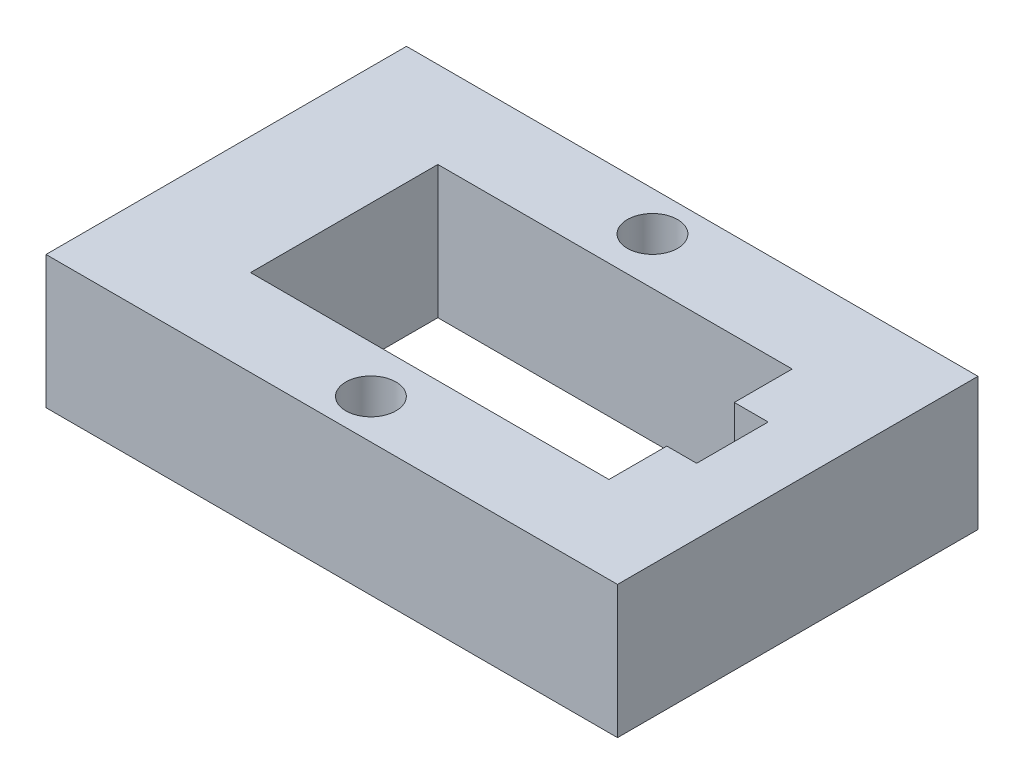
ISO-10303-21;
HEADER;
FILE_DESCRIPTION(('STEP AP214'),'2;1');
FILE_NAME('part.step','',(''),(''),'','','');
FILE_SCHEMA(('AUTOMOTIVE_DESIGN { 1 0 10303 214 1 1 1 1 }'));
ENDSEC;
DATA;
#1=APPLICATION_CONTEXT('core data for automotive mechanical design processes');
#2=APPLICATION_PROTOCOL_DEFINITION('international standard','automotive_design',2000,#1);
#3=PRODUCT_CONTEXT('',#1,'mechanical');
#4=PRODUCT('Part','Part','',(#3));
#5=PRODUCT_RELATED_PRODUCT_CATEGORY('part','',(#4));
#6=PRODUCT_DEFINITION_FORMATION('','',#4);
#7=PRODUCT_DEFINITION_CONTEXT('part definition',#1,'design');
#8=PRODUCT_DEFINITION('design','',#6,#7);
#9=PRODUCT_DEFINITION_SHAPE('','',#8);
#10=(LENGTH_UNIT() NAMED_UNIT(*) SI_UNIT(.MILLI.,.METRE.));
#11=(NAMED_UNIT(*) PLANE_ANGLE_UNIT() SI_UNIT($,.RADIAN.));
#12=(NAMED_UNIT(*) SI_UNIT($,.STERADIAN.) SOLID_ANGLE_UNIT());
#13=UNCERTAINTY_MEASURE_WITH_UNIT(LENGTH_MEASURE(1.E-05),#10,'distance_accuracy_value','');
#14=(GEOMETRIC_REPRESENTATION_CONTEXT(3) GLOBAL_UNCERTAINTY_ASSIGNED_CONTEXT((#13)) GLOBAL_UNIT_ASSIGNED_CONTEXT((#10,
#11,#12)) REPRESENTATION_CONTEXT('',''));
#15=CARTESIAN_POINT('',(0.,0.,0.));
#16=DIRECTION('',(0.,0.,1.));
#17=DIRECTION('',(1.,0.,0.));
#18=AXIS2_PLACEMENT_3D('',#15,#16,#17);
#19=CARTESIAN_POINT('',(0.,4.5,0.));
#20=DIRECTION('',(0.,1.,0.));
#21=DIRECTION('',(0.,0.,1.));
#22=AXIS2_PLACEMENT_3D('',#19,#20,#21);
#23=PLANE('',#22);
#24=CARTESIAN_POINT('',(-1.2726821184778,4.5,-10.9543613464888));
#25=DIRECTION('',(0.,1.,0.));
#26=DIRECTION('',(0.,0.,1.));
#27=AXIS2_PLACEMENT_3D('',#24,#25,#26);
#28=CIRCLE('',#27,1.7);
#29=CARTESIAN_POINT('',(-1.2726821184778,4.5,-9.25436134648878));
#30=VERTEX_POINT('',#29);
#31=EDGE_CURVE('E177',#30,#30,#28,.T.);
#32=ORIENTED_EDGE('',*,*,#31,.F.);
#33=EDGE_LOOP('',(#32));
#34=FACE_BOUND('',#33,.T.);
#35=DIRECTION('',(0.,0.,1.));
#36=VECTOR('',#35,1.);
#37=CARTESIAN_POINT('',(-20.6290016384778,4.5,-13.6320813464888));
#38=LINE('',#37,#36);
#39=CARTESIAN_POINT('',(-20.6290016384778,4.5,-13.6320813464888));
#40=VERTEX_POINT('',#39);
#41=CARTESIAN_POINT('',(-20.6290016384778,4.5,10.8109486535112));
#42=VERTEX_POINT('',#41);
#43=EDGE_CURVE('E221',#40,#42,#38,.T.);
#44=ORIENTED_EDGE('',*,*,#43,.T.);
#45=DIRECTION('',(1.,0.,0.));
#46=VECTOR('',#45,1.);
#47=CARTESIAN_POINT('',(-20.6290016384778,4.5,10.8109486535112));
#48=LINE('',#47,#46);
#49=CARTESIAN_POINT('',(18.1229383615222,4.5,10.8109486535112));
#50=VERTEX_POINT('',#49);
#51=EDGE_CURVE('E225',#42,#50,#48,.T.);
#52=ORIENTED_EDGE('',*,*,#51,.T.);
#53=DIRECTION('',(0.,0.,-1.));
#54=VECTOR('',#53,1.);
#55=CARTESIAN_POINT('',(18.1229383615222,4.5,-13.6320813464888));
#56=LINE('',#55,#54);
#57=CARTESIAN_POINT('',(18.1229383615222,4.5,-13.6320813464888));
#58=VERTEX_POINT('',#57);
#59=EDGE_CURVE('E229',#50,#58,#56,.T.);
#60=ORIENTED_EDGE('',*,*,#59,.T.);
#61=DIRECTION('',(-1.,0.,0.));
#62=VECTOR('',#61,1.);
#63=CARTESIAN_POINT('',(-20.6290016384778,4.5,-13.6320813464888));
#64=LINE('',#63,#62);
#65=EDGE_CURVE('E232',#58,#40,#64,.T.);
#66=ORIENTED_EDGE('',*,*,#65,.T.);
#67=EDGE_LOOP('',(#44,#52,#60,#66));
#68=FACE_BOUND('',#67,.T.);
#69=DIRECTION('',(1.,0.,0.));
#70=VECTOR('',#69,1.);
#71=CARTESIAN_POINT('',(11.6709983615222,4.5,4.94094865351122));
#72=LINE('',#71,#70);
#73=CARTESIAN_POINT('',(-12.6290016384778,4.5,4.94094865351122));
#74=VERTEX_POINT('',#73);
#75=CARTESIAN_POINT('',(11.6709983615222,4.5,4.94094865351122));
#76=VERTEX_POINT('',#75);
#77=EDGE_CURVE('E138',#74,#76,#72,.T.);
#78=ORIENTED_EDGE('',*,*,#77,.F.);
#79=DIRECTION('',(0.,0.,1.));
#80=VECTOR('',#79,1.);
#81=CARTESIAN_POINT('',(-12.6290016384778,4.5,4.94094865351122));
#82=LINE('',#81,#80);
#83=CARTESIAN_POINT('',(-12.6290016384778,4.5,-7.75905134648878));
#84=VERTEX_POINT('',#83);
#85=EDGE_CURVE('E129',#84,#74,#82,.T.);
#86=ORIENTED_EDGE('',*,*,#85,.F.);
#87=DIRECTION('',(-1.,0.,0.));
#88=VECTOR('',#87,1.);
#89=CARTESIAN_POINT('',(-12.6290016384778,4.5,-7.75905134648878));
#90=LINE('',#89,#88);
#91=CARTESIAN_POINT('',(11.3955588266385,4.5,-7.75905134648878));
#92=VERTEX_POINT('',#91);
#93=EDGE_CURVE('E172',#92,#84,#90,.T.);
#94=ORIENTED_EDGE('',*,*,#93,.F.);
#95=DIRECTION('',(0.,0.,-1.));
#96=VECTOR('',#95,1.);
#97=CARTESIAN_POINT('',(11.3955588266385,4.5,-7.75905134648878));
#98=LINE('',#97,#96);
#99=CARTESIAN_POINT('',(11.3955588266385,4.5,-3.83394634648878));
#100=VERTEX_POINT('',#99);
#101=EDGE_CURVE('E169',#100,#92,#98,.T.);
#102=ORIENTED_EDGE('',*,*,#101,.F.);
#103=DIRECTION('',(-1.,0.,0.));
#104=VECTOR('',#103,1.);
#105=CARTESIAN_POINT('',(11.3955588266385,4.5,-3.83394634648878));
#106=LINE('',#105,#104);
#107=CARTESIAN_POINT('',(13.6929483615222,4.5,-3.83394634648878));
#108=VERTEX_POINT('',#107);
#109=EDGE_CURVE('E166',#108,#100,#106,.T.);
#110=ORIENTED_EDGE('',*,*,#109,.F.);
#111=DIRECTION('',(0.,0.,-1.));
#112=VECTOR('',#111,1.);
#113=CARTESIAN_POINT('',(13.6929483615222,4.5,-3.83394634648878));
#114=LINE('',#113,#112);
#115=CARTESIAN_POINT('',(13.6929483615222,4.5,1.01584365351122));
#116=VERTEX_POINT('',#115);
#117=EDGE_CURVE('E163',#116,#108,#114,.T.);
#118=ORIENTED_EDGE('',*,*,#117,.F.);
#119=DIRECTION('',(1.,0.,0.));
#120=VECTOR('',#119,1.);
#121=CARTESIAN_POINT('',(13.6929483615222,4.5,1.01584365351122));
#122=LINE('',#121,#120);
#123=CARTESIAN_POINT('',(11.6709983615222,4.5,1.01584365351122));
#124=VERTEX_POINT('',#123);
#125=EDGE_CURVE('E157',#124,#116,#122,.T.);
#126=ORIENTED_EDGE('',*,*,#125,.F.);
#127=DIRECTION('',(0.,0.,-1.));
#128=VECTOR('',#127,1.);
#129=CARTESIAN_POINT('',(11.6709983615222,4.5,1.01584365351122));
#130=LINE('',#129,#128);
#131=EDGE_CURVE('E153',#76,#124,#130,.T.);
#132=ORIENTED_EDGE('',*,*,#131,.F.);
#133=EDGE_LOOP('',(#78,#86,#94,#102,#110,#118,#126,#132));
#134=FACE_BOUND('',#133,.T.);
#135=CARTESIAN_POINT('',(-1.27706163847779,4.5,8.13094865351122));
#136=DIRECTION('',(0.,1.,0.));
#137=DIRECTION('',(0.,0.,1.));
#138=AXIS2_PLACEMENT_3D('',#135,#136,#137);
#139=CIRCLE('',#138,1.7);
#140=CARTESIAN_POINT('',(-1.27706163847779,4.5,9.83094865351122));
#141=VERTEX_POINT('',#140);
#142=EDGE_CURVE('E338',#141,#141,#139,.T.);
#143=ORIENTED_EDGE('',*,*,#142,.F.);
#144=EDGE_LOOP('',(#143));
#145=FACE_BOUND('',#144,.T.);
#146=ADVANCED_FACE('F39',(#34,#68,#134,#145),#23,.T.);
#147=CARTESIAN_POINT('',(0.,-4.5,0.));
#148=DIRECTION('',(0.,1.,0.));
#149=DIRECTION('',(0.,0.,1.));
#150=AXIS2_PLACEMENT_3D('',#147,#148,#149);
#151=PLANE('',#150);
#152=DIRECTION('',(0.,0.,1.));
#153=VECTOR('',#152,1.);
#154=CARTESIAN_POINT('',(-20.6290016384778,-4.5,-13.6320813464888));
#155=LINE('',#154,#153);
#156=CARTESIAN_POINT('',(-20.6290016384778,-4.5,-13.6320813464888));
#157=VERTEX_POINT('',#156);
#158=CARTESIAN_POINT('',(-20.6290016384778,-4.5,10.8109486535112));
#159=VERTEX_POINT('',#158);
#160=EDGE_CURVE('E147',#157,#159,#155,.T.);
#161=ORIENTED_EDGE('',*,*,#160,.F.);
#162=DIRECTION('',(-1.,0.,0.));
#163=VECTOR('',#162,1.);
#164=CARTESIAN_POINT('',(-20.6290016384778,-4.5,-13.6320813464888));
#165=LINE('',#164,#163);
#166=CARTESIAN_POINT('',(18.1229383615222,-4.5,-13.6320813464888));
#167=VERTEX_POINT('',#166);
#168=EDGE_CURVE('E226',#167,#157,#165,.T.);
#169=ORIENTED_EDGE('',*,*,#168,.F.);
#170=DIRECTION('',(0.,0.,-1.));
#171=VECTOR('',#170,1.);
#172=CARTESIAN_POINT('',(18.1229383615222,-4.5,-13.6320813464888));
#173=LINE('',#172,#171);
#174=CARTESIAN_POINT('',(18.1229383615222,-4.5,10.8109486535112));
#175=VERTEX_POINT('',#174);
#176=EDGE_CURVE('E242',#175,#167,#173,.T.);
#177=ORIENTED_EDGE('',*,*,#176,.F.);
#178=DIRECTION('',(1.,0.,0.));
#179=VECTOR('',#178,1.);
#180=CARTESIAN_POINT('',(-20.6290016384778,-4.5,10.8109486535112));
#181=LINE('',#180,#179);
#182=EDGE_CURVE('E239',#159,#175,#181,.T.);
#183=ORIENTED_EDGE('',*,*,#182,.F.);
#184=EDGE_LOOP('',(#161,#169,#177,#183));
#185=FACE_BOUND('',#184,.T.);
#186=DIRECTION('',(0.,0.,1.));
#187=VECTOR('',#186,1.);
#188=CARTESIAN_POINT('',(-12.6290016384778,-4.5,4.94094865351122));
#189=LINE('',#188,#187);
#190=CARTESIAN_POINT('',(-12.6290016384778,-4.5,-7.75905134648878));
#191=VERTEX_POINT('',#190);
#192=CARTESIAN_POINT('',(-12.6290016384778,-4.5,4.94094865351122));
#193=VERTEX_POINT('',#192);
#194=EDGE_CURVE('E63',#191,#193,#189,.T.);
#195=ORIENTED_EDGE('',*,*,#194,.T.);
#196=DIRECTION('',(1.,0.,0.));
#197=VECTOR('',#196,1.);
#198=CARTESIAN_POINT('',(11.6709983615222,-4.5,4.94094865351122));
#199=LINE('',#198,#197);
#200=CARTESIAN_POINT('',(11.6709983615222,-4.5,4.94094865351122));
#201=VERTEX_POINT('',#200);
#202=EDGE_CURVE('E145',#193,#201,#199,.T.);
#203=ORIENTED_EDGE('',*,*,#202,.T.);
#204=DIRECTION('',(0.,0.,-1.));
#205=VECTOR('',#204,1.);
#206=CARTESIAN_POINT('',(11.6709983615222,-4.5,1.01584365351122));
#207=LINE('',#206,#205);
#208=CARTESIAN_POINT('',(11.6709983615222,-4.5,1.01584365351122));
#209=VERTEX_POINT('',#208);
#210=EDGE_CURVE('E180',#201,#209,#207,.T.);
#211=ORIENTED_EDGE('',*,*,#210,.T.);
#212=DIRECTION('',(1.,0.,0.));
#213=VECTOR('',#212,1.);
#214=CARTESIAN_POINT('',(13.6929483615222,-4.5,1.01584365351122));
#215=LINE('',#214,#213);
#216=CARTESIAN_POINT('',(13.6929483615222,-4.5,1.01584365351122));
#217=VERTEX_POINT('',#216);
#218=EDGE_CURVE('E184',#209,#217,#215,.T.);
#219=ORIENTED_EDGE('',*,*,#218,.T.);
#220=DIRECTION('',(0.,0.,-1.));
#221=VECTOR('',#220,1.);
#222=CARTESIAN_POINT('',(13.6929483615222,-4.5,-3.83394634648878));
#223=LINE('',#222,#221);
#224=CARTESIAN_POINT('',(13.6929483615222,-4.5,-3.83394634648878));
#225=VERTEX_POINT('',#224);
#226=EDGE_CURVE('E188',#217,#225,#223,.T.);
#227=ORIENTED_EDGE('',*,*,#226,.T.);
#228=DIRECTION('',(-1.,0.,0.));
#229=VECTOR('',#228,1.);
#230=CARTESIAN_POINT('',(11.3955588266385,-4.5,-3.83394634648878));
#231=LINE('',#230,#229);
#232=CARTESIAN_POINT('',(11.3955588266385,-4.5,-3.83394634648878));
#233=VERTEX_POINT('',#232);
#234=EDGE_CURVE('E192',#225,#233,#231,.T.);
#235=ORIENTED_EDGE('',*,*,#234,.T.);
#236=DIRECTION('',(0.,0.,-1.));
#237=VECTOR('',#236,1.);
#238=CARTESIAN_POINT('',(11.3955588266385,-4.5,-7.75905134648878));
#239=LINE('',#238,#237);
#240=CARTESIAN_POINT('',(11.3955588266385,-4.5,-7.75905134648878));
#241=VERTEX_POINT('',#240);
#242=EDGE_CURVE('E196',#233,#241,#239,.T.);
#243=ORIENTED_EDGE('',*,*,#242,.T.);
#244=DIRECTION('',(-1.,0.,0.));
#245=VECTOR('',#244,1.);
#246=CARTESIAN_POINT('',(-12.6290016384778,-4.5,-7.75905134648878));
#247=LINE('',#246,#245);
#248=EDGE_CURVE('E139',#241,#191,#247,.T.);
#249=ORIENTED_EDGE('',*,*,#248,.T.);
#250=EDGE_LOOP('',(#195,#203,#211,#219,#227,#235,#243,#249));
#251=FACE_BOUND('',#250,.T.);
#252=CARTESIAN_POINT('',(-1.2726821184778,-4.5,-10.9543613464888));
#253=DIRECTION('',(0.,1.,0.));
#254=DIRECTION('',(0.,0.,1.));
#255=AXIS2_PLACEMENT_3D('',#252,#253,#254);
#256=CIRCLE('',#255,1.7);
#257=CARTESIAN_POINT('',(-1.2726821184778,-4.5,-9.25436134648878));
#258=VERTEX_POINT('',#257);
#259=EDGE_CURVE('E346',#258,#258,#256,.T.);
#260=ORIENTED_EDGE('',*,*,#259,.T.);
#261=EDGE_LOOP('',(#260));
#262=FACE_BOUND('',#261,.T.);
#263=CARTESIAN_POINT('',(-1.27706163847779,-4.5,8.13094865351122));
#264=DIRECTION('',(0.,1.,0.));
#265=DIRECTION('',(0.,0.,1.));
#266=AXIS2_PLACEMENT_3D('',#263,#264,#265);
#267=CIRCLE('',#266,1.7);
#268=CARTESIAN_POINT('',(-1.27706163847779,-4.5,9.83094865351122));
#269=VERTEX_POINT('',#268);
#270=EDGE_CURVE('E341',#269,#269,#267,.T.);
#271=ORIENTED_EDGE('',*,*,#270,.T.);
#272=EDGE_LOOP('',(#271));
#273=FACE_BOUND('',#272,.T.);
#274=ADVANCED_FACE('F265',(#185,#251,#262,#273),#151,.F.);
#275=CARTESIAN_POINT('',(-20.6290016384778,4.5,-13.6320813464888));
#276=DIRECTION('',(1.,0.,0.));
#277=DIRECTION('',(0.,0.,-1.));
#278=AXIS2_PLACEMENT_3D('',#275,#276,#277);
#279=PLANE('',#278);
#280=ORIENTED_EDGE('',*,*,#160,.T.);
#281=DIRECTION('',(0.,-1.,0.));
#282=VECTOR('',#281,1.);
#283=CARTESIAN_POINT('',(-20.6290016384778,4.5,10.8109486535112));
#284=LINE('',#283,#282);
#285=EDGE_CURVE('E11',#42,#159,#284,.T.);
#286=ORIENTED_EDGE('',*,*,#285,.F.);
#287=ORIENTED_EDGE('',*,*,#43,.F.);
#288=DIRECTION('',(0.,-1.,0.));
#289=VECTOR('',#288,1.);
#290=CARTESIAN_POINT('',(-20.6290016384778,4.5,-13.6320813464888));
#291=LINE('',#290,#289);
#292=EDGE_CURVE('E235',#40,#157,#291,.T.);
#293=ORIENTED_EDGE('',*,*,#292,.T.);
#294=EDGE_LOOP('',(#280,#286,#287,#293));
#295=FACE_BOUND('',#294,.T.);
#296=ADVANCED_FACE('F41',(#295),#279,.F.);
#297=CARTESIAN_POINT('',(-20.6290016384778,4.5,10.8109486535112));
#298=DIRECTION('',(0.,0.,-1.));
#299=DIRECTION('',(-1.,0.,0.));
#300=AXIS2_PLACEMENT_3D('',#297,#298,#299);
#301=PLANE('',#300);
#302=ORIENTED_EDGE('',*,*,#182,.T.);
#303=DIRECTION('',(0.,-1.,0.));
#304=VECTOR('',#303,1.);
#305=CARTESIAN_POINT('',(18.1229383615222,4.5,10.8109486535112));
#306=LINE('',#305,#304);
#307=EDGE_CURVE('E48',#50,#175,#306,.T.);
#308=ORIENTED_EDGE('',*,*,#307,.F.);
#309=ORIENTED_EDGE('',*,*,#51,.F.);
#310=ORIENTED_EDGE('',*,*,#285,.T.);
#311=EDGE_LOOP('',(#302,#308,#309,#310));
#312=FACE_BOUND('',#311,.T.);
#313=ADVANCED_FACE('F275',(#312),#301,.F.);
#314=CARTESIAN_POINT('',(18.1229383615222,4.5,-13.6320813464888));
#315=DIRECTION('',(-1.,0.,0.));
#316=DIRECTION('',(0.,0.,1.));
#317=AXIS2_PLACEMENT_3D('',#314,#315,#316);
#318=PLANE('',#317);
#319=ORIENTED_EDGE('',*,*,#176,.T.);
#320=DIRECTION('',(0.,-1.,0.));
#321=VECTOR('',#320,1.);
#322=CARTESIAN_POINT('',(18.1229383615222,4.5,-13.6320813464888));
#323=LINE('',#322,#321);
#324=EDGE_CURVE('E250',#58,#167,#323,.T.);
#325=ORIENTED_EDGE('',*,*,#324,.F.);
#326=ORIENTED_EDGE('',*,*,#59,.F.);
#327=ORIENTED_EDGE('',*,*,#307,.T.);
#328=EDGE_LOOP('',(#319,#325,#326,#327));
#329=FACE_BOUND('',#328,.T.);
#330=ADVANCED_FACE('F259',(#329),#318,.F.);
#331=CARTESIAN_POINT('',(-20.6290016384778,4.5,-13.6320813464888));
#332=DIRECTION('',(0.,0.,1.));
#333=DIRECTION('',(1.,0.,0.));
#334=AXIS2_PLACEMENT_3D('',#331,#332,#333);
#335=PLANE('',#334);
#336=ORIENTED_EDGE('',*,*,#168,.T.);
#337=ORIENTED_EDGE('',*,*,#292,.F.);
#338=ORIENTED_EDGE('',*,*,#65,.F.);
#339=ORIENTED_EDGE('',*,*,#324,.T.);
#340=EDGE_LOOP('',(#336,#337,#338,#339));
#341=FACE_BOUND('',#340,.T.);
#342=ADVANCED_FACE('F269',(#341),#335,.F.);
#343=CARTESIAN_POINT('',(-12.6290016384778,4.5,4.94094865351122));
#344=DIRECTION('',(1.,0.,0.));
#345=DIRECTION('',(0.,0.,-1.));
#346=AXIS2_PLACEMENT_3D('',#343,#344,#345);
#347=PLANE('',#346);
#348=ORIENTED_EDGE('',*,*,#194,.F.);
#349=DIRECTION('',(0.,-1.,0.));
#350=VECTOR('',#349,1.);
#351=CARTESIAN_POINT('',(-12.6290016384778,4.5,-7.75905134648878));
#352=LINE('',#351,#350);
#353=EDGE_CURVE('E133',#84,#191,#352,.T.);
#354=ORIENTED_EDGE('',*,*,#353,.F.);
#355=ORIENTED_EDGE('',*,*,#85,.T.);
#356=DIRECTION('',(0.,-1.,0.));
#357=VECTOR('',#356,1.);
#358=CARTESIAN_POINT('',(-12.6290016384778,4.5,4.94094865351122));
#359=LINE('',#358,#357);
#360=EDGE_CURVE('E132',#74,#193,#359,.T.);
#361=ORIENTED_EDGE('',*,*,#360,.T.);
#362=EDGE_LOOP('',(#348,#354,#355,#361));
#363=FACE_BOUND('',#362,.T.);
#364=ADVANCED_FACE('F131',(#363),#347,.T.);
#365=CARTESIAN_POINT('',(11.6709983615222,4.5,4.94094865351122));
#366=DIRECTION('',(0.,0.,-1.));
#367=DIRECTION('',(-1.,0.,0.));
#368=AXIS2_PLACEMENT_3D('',#365,#366,#367);
#369=PLANE('',#368);
#370=ORIENTED_EDGE('',*,*,#202,.F.);
#371=ORIENTED_EDGE('',*,*,#360,.F.);
#372=ORIENTED_EDGE('',*,*,#77,.T.);
#373=DIRECTION('',(0.,-1.,0.));
#374=VECTOR('',#373,1.);
#375=CARTESIAN_POINT('',(11.6709983615222,4.5,4.94094865351122));
#376=LINE('',#375,#374);
#377=EDGE_CURVE('E148',#76,#201,#376,.T.);
#378=ORIENTED_EDGE('',*,*,#377,.T.);
#379=EDGE_LOOP('',(#370,#371,#372,#378));
#380=FACE_BOUND('',#379,.T.);
#381=ADVANCED_FACE('F142',(#380),#369,.T.);
#382=CARTESIAN_POINT('',(11.6709983615222,4.5,1.01584365351122));
#383=DIRECTION('',(-1.,0.,0.));
#384=DIRECTION('',(0.,0.,1.));
#385=AXIS2_PLACEMENT_3D('',#382,#383,#384);
#386=PLANE('',#385);
#387=ORIENTED_EDGE('',*,*,#210,.F.);
#388=ORIENTED_EDGE('',*,*,#377,.F.);
#389=ORIENTED_EDGE('',*,*,#131,.T.);
#390=DIRECTION('',(0.,-1.,0.));
#391=VECTOR('',#390,1.);
#392=CARTESIAN_POINT('',(11.6709983615222,4.5,1.01584365351122));
#393=LINE('',#392,#391);
#394=EDGE_CURVE('E216',#124,#209,#393,.T.);
#395=ORIENTED_EDGE('',*,*,#394,.T.);
#396=EDGE_LOOP('',(#387,#388,#389,#395));
#397=FACE_BOUND('',#396,.T.);
#398=ADVANCED_FACE('F300',(#397),#386,.T.);
#399=CARTESIAN_POINT('',(13.6929483615222,4.5,1.01584365351122));
#400=DIRECTION('',(0.,0.,-1.));
#401=DIRECTION('',(-1.,0.,0.));
#402=AXIS2_PLACEMENT_3D('',#399,#400,#401);
#403=PLANE('',#402);
#404=ORIENTED_EDGE('',*,*,#218,.F.);
#405=ORIENTED_EDGE('',*,*,#394,.F.);
#406=ORIENTED_EDGE('',*,*,#125,.T.);
#407=DIRECTION('',(0.,-1.,0.));
#408=VECTOR('',#407,1.);
#409=CARTESIAN_POINT('',(13.6929483615222,4.5,1.01584365351122));
#410=LINE('',#409,#408);
#411=EDGE_CURVE('E213',#116,#217,#410,.T.);
#412=ORIENTED_EDGE('',*,*,#411,.T.);
#413=EDGE_LOOP('',(#404,#405,#406,#412));
#414=FACE_BOUND('',#413,.T.);
#415=ADVANCED_FACE('F304',(#414),#403,.T.);
#416=CARTESIAN_POINT('',(13.6929483615222,4.5,-3.83394634648878));
#417=DIRECTION('',(-1.,0.,0.));
#418=DIRECTION('',(0.,0.,1.));
#419=AXIS2_PLACEMENT_3D('',#416,#417,#418);
#420=PLANE('',#419);
#421=ORIENTED_EDGE('',*,*,#226,.F.);
#422=ORIENTED_EDGE('',*,*,#411,.F.);
#423=ORIENTED_EDGE('',*,*,#117,.T.);
#424=DIRECTION('',(0.,-1.,0.));
#425=VECTOR('',#424,1.);
#426=CARTESIAN_POINT('',(13.6929483615222,4.5,-3.83394634648878));
#427=LINE('',#426,#425);
#428=EDGE_CURVE('E210',#108,#225,#427,.T.);
#429=ORIENTED_EDGE('',*,*,#428,.T.);
#430=EDGE_LOOP('',(#421,#422,#423,#429));
#431=FACE_BOUND('',#430,.T.);
#432=ADVANCED_FACE('F310',(#431),#420,.T.);
#433=CARTESIAN_POINT('',(11.3955588266385,4.5,-3.83394634648878));
#434=DIRECTION('',(0.,0.,1.));
#435=DIRECTION('',(1.,0.,0.));
#436=AXIS2_PLACEMENT_3D('',#433,#434,#435);
#437=PLANE('',#436);
#438=ORIENTED_EDGE('',*,*,#234,.F.);
#439=ORIENTED_EDGE('',*,*,#428,.F.);
#440=ORIENTED_EDGE('',*,*,#109,.T.);
#441=DIRECTION('',(0.,-1.,0.));
#442=VECTOR('',#441,1.);
#443=CARTESIAN_POINT('',(11.3955588266385,4.5,-3.83394634648878));
#444=LINE('',#443,#442);
#445=EDGE_CURVE('E207',#100,#233,#444,.T.);
#446=ORIENTED_EDGE('',*,*,#445,.T.);
#447=EDGE_LOOP('',(#438,#439,#440,#446));
#448=FACE_BOUND('',#447,.T.);
#449=ADVANCED_FACE('F314',(#448),#437,.T.);
#450=CARTESIAN_POINT('',(11.3955588266385,4.5,-7.75905134648878));
#451=DIRECTION('',(-1.,0.,0.));
#452=DIRECTION('',(0.,0.,1.));
#453=AXIS2_PLACEMENT_3D('',#450,#451,#452);
#454=PLANE('',#453);
#455=ORIENTED_EDGE('',*,*,#242,.F.);
#456=ORIENTED_EDGE('',*,*,#445,.F.);
#457=ORIENTED_EDGE('',*,*,#101,.T.);
#458=DIRECTION('',(0.,-1.,0.));
#459=VECTOR('',#458,1.);
#460=CARTESIAN_POINT('',(11.3955588266385,4.5,-7.75905134648878));
#461=LINE('',#460,#459);
#462=EDGE_CURVE('E55',#92,#241,#461,.T.);
#463=ORIENTED_EDGE('',*,*,#462,.T.);
#464=EDGE_LOOP('',(#455,#456,#457,#463));
#465=FACE_BOUND('',#464,.T.);
#466=ADVANCED_FACE('F318',(#465),#454,.T.);
#467=CARTESIAN_POINT('',(-12.6290016384778,4.5,-7.75905134648878));
#468=DIRECTION('',(0.,0.,1.));
#469=DIRECTION('',(1.,0.,0.));
#470=AXIS2_PLACEMENT_3D('',#467,#468,#469);
#471=PLANE('',#470);
#472=ORIENTED_EDGE('',*,*,#248,.F.);
#473=ORIENTED_EDGE('',*,*,#462,.F.);
#474=ORIENTED_EDGE('',*,*,#93,.T.);
#475=ORIENTED_EDGE('',*,*,#353,.T.);
#476=EDGE_LOOP('',(#472,#473,#474,#475));
#477=FACE_BOUND('',#476,.T.);
#478=ADVANCED_FACE('F322',(#477),#471,.T.);
#479=CARTESIAN_POINT('',(-1.2726821184778,4.5,-10.9543613464888));
#480=DIRECTION('',(0.,-1.,0.));
#481=DIRECTION('',(0.,0.,-1.));
#482=AXIS2_PLACEMENT_3D('',#479,#480,#481);
#483=CYLINDRICAL_SURFACE('',#482,1.7);
#484=ORIENTED_EDGE('',*,*,#31,.T.);
#485=EDGE_LOOP('',(#484));
#486=FACE_BOUND('',#485,.T.);
#487=ORIENTED_EDGE('',*,*,#259,.F.);
#488=EDGE_LOOP('',(#487));
#489=FACE_BOUND('',#488,.T.);
#490=ADVANCED_FACE('F326',(#486,#489),#483,.F.);
#491=CARTESIAN_POINT('',(-1.27706163847779,4.5,8.13094865351122));
#492=DIRECTION('',(0.,-1.,0.));
#493=DIRECTION('',(0.,0.,-1.));
#494=AXIS2_PLACEMENT_3D('',#491,#492,#493);
#495=CYLINDRICAL_SURFACE('',#494,1.7);
#496=ORIENTED_EDGE('',*,*,#142,.T.);
#497=EDGE_LOOP('',(#496));
#498=FACE_BOUND('',#497,.T.);
#499=ORIENTED_EDGE('',*,*,#270,.F.);
#500=EDGE_LOOP('',(#499));
#501=FACE_BOUND('',#500,.T.);
#502=ADVANCED_FACE('F329',(#498,#501),#495,.F.);
#503=CLOSED_SHELL('',(#146,#274,#296,#313,#330,#342,#364,#381,#398,#415,#432,#449,#466,#478,
#490,#502));
#504=MANIFOLD_SOLID_BREP('B2',#503);
#505=ADVANCED_BREP_SHAPE_REPRESENTATION('',(#18,#504),#14);
#506=SHAPE_DEFINITION_REPRESENTATION(#9,#505);
ENDSEC;
END-ISO-10303-21;
